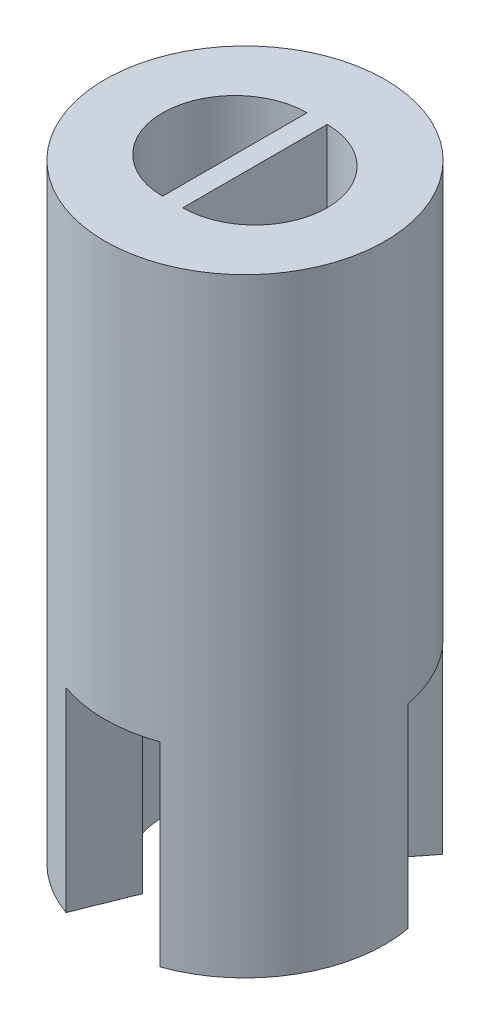
ISO-10303-21;
HEADER;
FILE_DESCRIPTION(('STEP AP214'),'2;1');
FILE_NAME('part.step','',(''),(''),'','','');
FILE_SCHEMA(('AUTOMOTIVE_DESIGN { 1 0 10303 214 1 1 1 1 }'));
ENDSEC;
DATA;
#1=APPLICATION_CONTEXT('core data for automotive mechanical design processes');
#2=APPLICATION_PROTOCOL_DEFINITION('international standard','automotive_design',2000,#1);
#3=PRODUCT_CONTEXT('',#1,'mechanical');
#4=PRODUCT('Part','Part','',(#3));
#5=PRODUCT_RELATED_PRODUCT_CATEGORY('part','',(#4));
#6=PRODUCT_DEFINITION_FORMATION('','',#4);
#7=PRODUCT_DEFINITION_CONTEXT('part definition',#1,'design');
#8=PRODUCT_DEFINITION('design','',#6,#7);
#9=PRODUCT_DEFINITION_SHAPE('','',#8);
#10=(LENGTH_UNIT() NAMED_UNIT(*) SI_UNIT(.MILLI.,.METRE.));
#11=(NAMED_UNIT(*) PLANE_ANGLE_UNIT() SI_UNIT($,.RADIAN.));
#12=(NAMED_UNIT(*) SI_UNIT($,.STERADIAN.) SOLID_ANGLE_UNIT());
#13=UNCERTAINTY_MEASURE_WITH_UNIT(LENGTH_MEASURE(1.E-05),#10,'distance_accuracy_value','');
#14=(GEOMETRIC_REPRESENTATION_CONTEXT(3) GLOBAL_UNCERTAINTY_ASSIGNED_CONTEXT((#13)) GLOBAL_UNIT_ASSIGNED_CONTEXT((#10,
#11,#12)) REPRESENTATION_CONTEXT('',''));
#15=CARTESIAN_POINT('',(0.,0.,0.));
#16=DIRECTION('',(0.,0.,1.));
#17=DIRECTION('',(1.,0.,0.));
#18=AXIS2_PLACEMENT_3D('',#15,#16,#17);
#19=CARTESIAN_POINT('',(0.,25.,0.));
#20=DIRECTION('',(0.,-1.,0.));
#21=DIRECTION('',(0.,0.,-1.));
#22=AXIS2_PLACEMENT_3D('',#19,#20,#21);
#23=CYLINDRICAL_SURFACE('',#22,5.75);
#24=CARTESIAN_POINT('',(0.,25.,0.));
#25=DIRECTION('',(0.,1.,0.));
#26=DIRECTION('',(0.,0.,1.));
#27=AXIS2_PLACEMENT_3D('',#24,#25,#26);
#28=CIRCLE('',#27,5.75);
#29=CARTESIAN_POINT('',(0.,25.,5.75));
#30=VERTEX_POINT('',#29);
#31=EDGE_CURVE('E11',#30,#30,#28,.T.);
#32=ORIENTED_EDGE('',*,*,#31,.F.);
#33=EDGE_LOOP('',(#32));
#34=FACE_BOUND('',#33,.T.);
#35=DIRECTION('',(0.,-1.,0.));
#36=VECTOR('',#35,1.);
#37=CARTESIAN_POINT('',(5.65640898932112,8.,-1.03321698859788));
#38=LINE('',#37,#36);
#39=CARTESIAN_POINT('',(5.65640898932112,8.,-1.03321698859788));
#40=VERTEX_POINT('',#39);
#41=CARTESIAN_POINT('',(5.65640898932112,0.,-1.03321698859788));
#42=VERTEX_POINT('',#41);
#43=EDGE_CURVE('E231',#40,#42,#38,.T.);
#44=ORIENTED_EDGE('',*,*,#43,.F.);
#45=CARTESIAN_POINT('',(-6.48755282626165E-13,8.,2.36346093978593E-13));
#46=DIRECTION('',(0.,1.,0.));
#47=DIRECTION('',(0.866025403784436,0.,-0.500000000000004));
#48=AXIS2_PLACEMENT_3D('',#45,#46,#47);
#49=CIRCLE('',#48,5.75000000000065);
#50=CARTESIAN_POINT('',(3.72299665440796,8.,-4.38198538464789));
#51=VERTEX_POINT('',#50);
#52=EDGE_CURVE('E209',#40,#51,#49,.T.);
#53=ORIENTED_EDGE('',*,*,#52,.T.);
#54=DIRECTION('',(0.,-1.,0.));
#55=VECTOR('',#54,1.);
#56=CARTESIAN_POINT('',(3.72299665440796,8.,-4.38198538464789));
#57=LINE('',#56,#55);
#58=CARTESIAN_POINT('',(3.72299665440796,0.,-4.38198538464789));
#59=VERTEX_POINT('',#58);
#60=EDGE_CURVE('E227',#51,#59,#57,.T.);
#61=ORIENTED_EDGE('',*,*,#60,.T.);
#62=CARTESIAN_POINT('',(0.,0.,0.));
#63=DIRECTION('',(0.,1.,0.));
#64=DIRECTION('',(0.,0.,1.));
#65=AXIS2_PLACEMENT_3D('',#62,#63,#64);
#66=CIRCLE('',#65,5.75);
#67=CARTESIAN_POINT('',(-3.722996654408,0.,-4.38198538464779));
#68=VERTEX_POINT('',#67);
#69=EDGE_CURVE('E345',#59,#68,#66,.T.);
#70=ORIENTED_EDGE('',*,*,#69,.T.);
#71=DIRECTION('',(0.,-1.,0.));
#72=VECTOR('',#71,1.);
#73=CARTESIAN_POINT('',(-3.722996654408,8.,-4.38198538464779));
#74=LINE('',#73,#72);
#75=CARTESIAN_POINT('',(-3.722996654408,8.,-4.38198538464779));
#76=VERTEX_POINT('',#75);
#77=EDGE_CURVE('E267',#76,#68,#74,.T.);
#78=ORIENTED_EDGE('',*,*,#77,.F.);
#79=CARTESIAN_POINT('',(5.29059362783771E-13,8.,4.43665508604313E-13));
#80=DIRECTION('',(0.,1.,0.));
#81=DIRECTION('',(-0.866025403784443,0.,-0.499999999999992));
#82=AXIS2_PLACEMENT_3D('',#79,#80,#81);
#83=CIRCLE('',#82,5.75000000000065);
#84=CARTESIAN_POINT('',(-5.65640898932118,8.,-1.0332169885978));
#85=VERTEX_POINT('',#84);
#86=EDGE_CURVE('E247',#76,#85,#83,.T.);
#87=ORIENTED_EDGE('',*,*,#86,.T.);
#88=DIRECTION('',(0.,-1.,0.));
#89=VECTOR('',#88,1.);
#90=CARTESIAN_POINT('',(-5.65640898932118,8.,-1.0332169885978));
#91=LINE('',#90,#89);
#92=CARTESIAN_POINT('',(-5.65640898932118,0.,-1.0332169885978));
#93=VERTEX_POINT('',#92);
#94=EDGE_CURVE('E263',#85,#93,#91,.T.);
#95=ORIENTED_EDGE('',*,*,#94,.T.);
#96=CARTESIAN_POINT('',(-1.93341233491316,0.,5.41520237324568));
#97=VERTEX_POINT('',#96);
#98=EDGE_CURVE('E314',#93,#97,#66,.T.);
#99=ORIENTED_EDGE('',*,*,#98,.T.);
#100=DIRECTION('',(0.,-1.,0.));
#101=VECTOR('',#100,1.);
#102=CARTESIAN_POINT('',(-1.93341233491316,8.,5.41520237324568));
#103=LINE('',#102,#101);
#104=CARTESIAN_POINT('',(-1.93341233491316,8.,5.41520237324568));
#105=VERTEX_POINT('',#104);
#106=EDGE_CURVE('E301',#105,#97,#103,.T.);
#107=ORIENTED_EDGE('',*,*,#106,.F.);
#108=CARTESIAN_POINT('',(1.196959198424E-13,8.,-6.80011602582908E-13));
#109=DIRECTION('',(0.,1.,0.));
#110=DIRECTION('',(0.,0.,1.));
#111=AXIS2_PLACEMENT_3D('',#108,#109,#110);
#112=CIRCLE('',#111,5.75000000000065);
#113=CARTESIAN_POINT('',(1.93341233491319,8.,5.41520237324572));
#114=VERTEX_POINT('',#113);
#115=EDGE_CURVE('E281',#105,#114,#112,.T.);
#116=ORIENTED_EDGE('',*,*,#115,.T.);
#117=DIRECTION('',(0.,-1.,0.));
#118=VECTOR('',#117,1.);
#119=CARTESIAN_POINT('',(1.93341233491319,8.,5.41520237324572));
#120=LINE('',#119,#118);
#121=CARTESIAN_POINT('',(1.93341233491319,0.,5.41520237324572));
#122=VERTEX_POINT('',#121);
#123=EDGE_CURVE('E297',#114,#122,#120,.T.);
#124=ORIENTED_EDGE('',*,*,#123,.T.);
#125=EDGE_CURVE('E42',#122,#42,#66,.T.);
#126=ORIENTED_EDGE('',*,*,#125,.T.);
#127=EDGE_LOOP('',(#44,#53,#61,#70,#78,#87,#95,#99,#107,#116,#124,#126));
#128=FACE_BOUND('',#127,.T.);
#129=ADVANCED_FACE('F39',(#34,#128),#23,.T.);
#130=CARTESIAN_POINT('',(0.,0.,0.));
#131=DIRECTION('',(0.,1.,0.));
#132=DIRECTION('',(0.,0.,1.));
#133=AXIS2_PLACEMENT_3D('',#130,#131,#132);
#134=PLANE('',#133);
#135=DIRECTION('',(0.989915319978048,0.,-0.141660365920607));
#136=VECTOR('',#135,1.);
#137=CARTESIAN_POINT('',(3.26919523018645,0.,-0.691598298771739));
#138=LINE('',#137,#136);
#139=CARTESIAN_POINT('',(3.26919523018645,0.,-0.691598298771739));
#140=VERTEX_POINT('',#139);
#141=EDGE_CURVE('E217',#140,#42,#138,.T.);
#142=ORIENTED_EDGE('',*,*,#141,.T.);
#143=ORIENTED_EDGE('',*,*,#125,.F.);
#144=DIRECTION('',(-0.372276184392376,0.,-0.928121997656695));
#145=VECTOR('',#144,1.);
#146=CARTESIAN_POINT('',(1.03565591914285,0.,3.17700526865825));
#147=LINE('',#146,#145);
#148=CARTESIAN_POINT('',(1.03565591914285,0.,3.17700526865825));
#149=VERTEX_POINT('',#148);
#150=EDGE_CURVE('E278',#122,#149,#147,.T.);
#151=ORIENTED_EDGE('',*,*,#150,.T.);
#152=CARTESIAN_POINT('',(0.,0.,0.));
#153=DIRECTION('',(0.,1.,0.));
#154=DIRECTION('',(0.,0.,1.));
#155=AXIS2_PLACEMENT_3D('',#152,#153,#154);
#156=CIRCLE('',#155,3.34154839257758);
#157=EDGE_CURVE('E315',#149,#140,#156,.T.);
#158=ORIENTED_EDGE('',*,*,#157,.T.);
#159=EDGE_LOOP('',(#142,#143,#151,#158));
#160=FACE_BOUND('',#159,.T.);
#161=ADVANCED_FACE('F351',(#160),#134,.F.);
#162=DIRECTION('',(-0.617639135585668,0.,0.786461631736088));
#163=VECTOR('',#162,1.);
#164=CARTESIAN_POINT('',(2.23353931104362,0.,-2.48540696988656));
#165=LINE('',#164,#163);
#166=CARTESIAN_POINT('',(2.23353931104362,0.,-2.48540696988656));
#167=VERTEX_POINT('',#166);
#168=EDGE_CURVE('E206',#59,#167,#165,.T.);
#169=ORIENTED_EDGE('',*,*,#168,.T.);
#170=CARTESIAN_POINT('',(-2.23353931104366,0.,-2.4854069698865));
#171=VERTEX_POINT('',#170);
#172=EDGE_CURVE('E318',#167,#171,#156,.T.);
#173=ORIENTED_EDGE('',*,*,#172,.T.);
#174=DIRECTION('',(-0.617639135585672,0.,-0.786461631736084));
#175=VECTOR('',#174,1.);
#176=CARTESIAN_POINT('',(-2.23353931104366,0.,-2.4854069698865));
#177=LINE('',#176,#175);
#178=EDGE_CURVE('E179',#171,#68,#177,.T.);
#179=ORIENTED_EDGE('',*,*,#178,.T.);
#180=ORIENTED_EDGE('',*,*,#69,.F.);
#181=EDGE_LOOP('',(#169,#173,#179,#180));
#182=FACE_BOUND('',#181,.T.);
#183=ADVANCED_FACE('F366',(#182),#134,.F.);
#184=DIRECTION('',(0.989915319978048,0.,0.141660365920601));
#185=VECTOR('',#184,1.);
#186=CARTESIAN_POINT('',(-3.26919523018648,0.,-0.69159829877167));
#187=LINE('',#186,#185);
#188=CARTESIAN_POINT('',(-3.26919523018648,0.,-0.69159829877167));
#189=VERTEX_POINT('',#188);
#190=EDGE_CURVE('E244',#93,#189,#187,.T.);
#191=ORIENTED_EDGE('',*,*,#190,.T.);
#192=CARTESIAN_POINT('',(-1.03565591914281,0.,3.17700526865825));
#193=VERTEX_POINT('',#192);
#194=EDGE_CURVE('E309',#189,#193,#156,.T.);
#195=ORIENTED_EDGE('',*,*,#194,.T.);
#196=DIRECTION('',(-0.372276184392383,0.,0.928121997656692));
#197=VECTOR('',#196,1.);
#198=CARTESIAN_POINT('',(-1.03565591914281,0.,3.17700526865825));
#199=LINE('',#198,#197);
#200=EDGE_CURVE('E238',#193,#97,#199,.T.);
#201=ORIENTED_EDGE('',*,*,#200,.T.);
#202=ORIENTED_EDGE('',*,*,#98,.F.);
#203=EDGE_LOOP('',(#191,#195,#201,#202));
#204=FACE_BOUND('',#203,.T.);
#205=ADVANCED_FACE('F327',(#204),#134,.F.);
#206=CARTESIAN_POINT('',(0.,15.,0.));
#207=DIRECTION('',(0.,-1.,0.));
#208=DIRECTION('',(0.,0.,-1.));
#209=AXIS2_PLACEMENT_3D('',#206,#207,#208);
#210=CYLINDRICAL_SURFACE('',#209,3.34154839257758);
#211=CARTESIAN_POINT('',(0.,15.,0.));
#212=DIRECTION('',(0.,1.,0.));
#213=DIRECTION('',(0.,0.,1.));
#214=AXIS2_PLACEMENT_3D('',#211,#212,#213);
#215=CIRCLE('',#214,3.34154839257758);
#216=CARTESIAN_POINT('',(0.,15.,3.34154839257758));
#217=VERTEX_POINT('',#216);
#218=EDGE_CURVE('E310',#217,#217,#215,.T.);
#219=ORIENTED_EDGE('',*,*,#218,.T.);
#220=EDGE_LOOP('',(#219));
#221=FACE_BOUND('',#220,.T.);
#222=CARTESIAN_POINT('',(-1.69317030779172E-13,8.,0.));
#223=DIRECTION('',(0.,-1.,0.));
#224=DIRECTION('',(0.866025403784436,0.,-0.500000000000004));
#225=AXIS2_PLACEMENT_3D('',#222,#223,#224);
#226=CIRCLE('',#225,3.34154839257776);
#227=CARTESIAN_POINT('',(2.23353931104362,8.,-2.48540696988656));
#228=VERTEX_POINT('',#227);
#229=CARTESIAN_POINT('',(3.26919523018645,8.,-0.691598298771739));
#230=VERTEX_POINT('',#229);
#231=EDGE_CURVE('E201',#228,#230,#226,.T.);
#232=ORIENTED_EDGE('',*,*,#231,.T.);
#233=DIRECTION('',(0.,-1.,0.));
#234=VECTOR('',#233,1.);
#235=CARTESIAN_POINT('',(3.26919523018645,8.,-0.691598298771739));
#236=LINE('',#235,#234);
#237=EDGE_CURVE('E234',#230,#140,#236,.T.);
#238=ORIENTED_EDGE('',*,*,#237,.T.);
#239=ORIENTED_EDGE('',*,*,#157,.F.);
#240=DIRECTION('',(0.,-1.,0.));
#241=VECTOR('',#240,1.);
#242=CARTESIAN_POINT('',(1.03565591914285,8.,3.17700526865825));
#243=LINE('',#242,#241);
#244=CARTESIAN_POINT('',(1.03565591914285,8.,3.17700526865825));
#245=VERTEX_POINT('',#244);
#246=EDGE_CURVE('E288',#245,#149,#243,.T.);
#247=ORIENTED_EDGE('',*,*,#246,.F.);
#248=CARTESIAN_POINT('',(0.,8.,-1.79110198894605E-13));
#249=DIRECTION('',(0.,-1.,0.));
#250=DIRECTION('',(0.,0.,1.));
#251=AXIS2_PLACEMENT_3D('',#248,#249,#250);
#252=CIRCLE('',#251,3.34154839257776);
#253=CARTESIAN_POINT('',(-1.03565591914281,8.,3.17700526865825));
#254=VERTEX_POINT('',#253);
#255=EDGE_CURVE('E273',#245,#254,#252,.T.);
#256=ORIENTED_EDGE('',*,*,#255,.T.);
#257=DIRECTION('',(0.,-1.,0.));
#258=VECTOR('',#257,1.);
#259=CARTESIAN_POINT('',(-1.03565591914281,8.,3.17700526865825));
#260=LINE('',#259,#258);
#261=EDGE_CURVE('E305',#254,#193,#260,.T.);
#262=ORIENTED_EDGE('',*,*,#261,.T.);
#263=ORIENTED_EDGE('',*,*,#194,.F.);
#264=DIRECTION('',(0.,-1.,0.));
#265=VECTOR('',#264,1.);
#266=CARTESIAN_POINT('',(-3.26919523018648,8.,-0.69159829877167));
#267=LINE('',#266,#265);
#268=CARTESIAN_POINT('',(-3.26919523018648,8.,-0.69159829877167));
#269=VERTEX_POINT('',#268);
#270=EDGE_CURVE('E254',#269,#189,#267,.T.);
#271=ORIENTED_EDGE('',*,*,#270,.F.);
#272=CARTESIAN_POINT('',(1.40910933860053E-13,8.,1.14155501001622E-13));
#273=DIRECTION('',(0.,-1.,0.));
#274=DIRECTION('',(-0.866025403784443,0.,-0.499999999999992));
#275=AXIS2_PLACEMENT_3D('',#272,#273,#274);
#276=CIRCLE('',#275,3.34154839257776);
#277=CARTESIAN_POINT('',(-2.23353931104366,8.,-2.4854069698865));
#278=VERTEX_POINT('',#277);
#279=EDGE_CURVE('E239',#269,#278,#276,.T.);
#280=ORIENTED_EDGE('',*,*,#279,.T.);
#281=DIRECTION('',(0.,-1.,0.));
#282=VECTOR('',#281,1.);
#283=CARTESIAN_POINT('',(-2.23353931104366,8.,-2.4854069698865));
#284=LINE('',#283,#282);
#285=EDGE_CURVE('E221',#278,#171,#284,.T.);
#286=ORIENTED_EDGE('',*,*,#285,.T.);
#287=ORIENTED_EDGE('',*,*,#172,.F.);
#288=DIRECTION('',(0.,-1.,0.));
#289=VECTOR('',#288,1.);
#290=CARTESIAN_POINT('',(2.23353931104362,8.,-2.48540696988656));
#291=LINE('',#290,#289);
#292=EDGE_CURVE('E216',#228,#167,#291,.T.);
#293=ORIENTED_EDGE('',*,*,#292,.F.);
#294=EDGE_LOOP('',(#232,#238,#239,#247,#256,#262,#263,#271,#280,#286,#287,#293));
#295=FACE_BOUND('',#294,.T.);
#296=ADVANCED_FACE('F335',(#221,#295),#210,.F.);
#297=CARTESIAN_POINT('',(0.,25.,0.));
#298=DIRECTION('',(0.,1.,0.));
#299=DIRECTION('',(0.,0.,1.));
#300=AXIS2_PLACEMENT_3D('',#297,#298,#299);
#301=PLANE('',#300);
#302=CARTESIAN_POINT('',(0.41,25.,0.));
#303=DIRECTION('',(0.,1.,0.));
#304=DIRECTION('',(0.,0.,-1.));
#305=AXIS2_PLACEMENT_3D('',#302,#303,#304);
#306=CIRCLE('',#305,2.96467159946198);
#307=CARTESIAN_POINT('',(0.41,25.,2.96467159946198));
#308=VERTEX_POINT('',#307);
#309=CARTESIAN_POINT('',(0.41,25.,-2.96467159946198));
#310=VERTEX_POINT('',#309);
#311=EDGE_CURVE('E54',#308,#310,#306,.T.);
#312=ORIENTED_EDGE('',*,*,#311,.F.);
#313=DIRECTION('',(0.,0.,1.));
#314=VECTOR('',#313,1.);
#315=CARTESIAN_POINT('',(0.41,25.,-2.96467159946198));
#316=LINE('',#315,#314);
#317=EDGE_CURVE('E166',#310,#308,#316,.T.);
#318=ORIENTED_EDGE('',*,*,#317,.F.);
#319=EDGE_LOOP('',(#312,#318));
#320=FACE_BOUND('',#319,.T.);
#321=CARTESIAN_POINT('',(-0.416408681207295,25.,0.));
#322=DIRECTION('',(0.,1.,0.));
#323=DIRECTION('',(0.,0.,1.));
#324=AXIS2_PLACEMENT_3D('',#321,#322,#323);
#325=CIRCLE('',#324,2.96556468188459);
#326=CARTESIAN_POINT('',(-0.416408681207295,25.,-2.96556468188459));
#327=VERTEX_POINT('',#326);
#328=CARTESIAN_POINT('',(-0.416408681207294,25.,2.96556468188459));
#329=VERTEX_POINT('',#328);
#330=EDGE_CURVE('E62',#327,#329,#325,.T.);
#331=ORIENTED_EDGE('',*,*,#330,.F.);
#332=DIRECTION('',(0.,0.,-1.));
#333=VECTOR('',#332,1.);
#334=CARTESIAN_POINT('',(-0.416408681207295,25.,-2.96556468188459));
#335=LINE('',#334,#333);
#336=EDGE_CURVE('E186',#329,#327,#335,.T.);
#337=ORIENTED_EDGE('',*,*,#336,.F.);
#338=EDGE_LOOP('',(#331,#337));
#339=FACE_BOUND('',#338,.T.);
#340=ORIENTED_EDGE('',*,*,#31,.T.);
#341=EDGE_LOOP('',(#340));
#342=FACE_BOUND('',#341,.T.);
#343=ADVANCED_FACE('F392',(#320,#339,#342),#301,.T.);
#344=CARTESIAN_POINT('',(0.,15.,0.));
#345=DIRECTION('',(0.,1.,0.));
#346=DIRECTION('',(0.,0.,1.));
#347=AXIS2_PLACEMENT_3D('',#344,#345,#346);
#348=PLANE('',#347);
#349=CARTESIAN_POINT('',(0.,15.,0.));
#350=DIRECTION('',(0.,-1.,0.));
#351=DIRECTION('',(0.,0.,-1.));
#352=AXIS2_PLACEMENT_3D('',#349,#350,#351);
#353=CIRCLE('',#352,0.9);
#354=CARTESIAN_POINT('',(0.,15.,-0.9));
#355=VERTEX_POINT('',#354);
#356=EDGE_CURVE('E553',#355,#355,#353,.T.);
#357=ORIENTED_EDGE('',*,*,#356,.F.);
#358=EDGE_LOOP('',(#357));
#359=FACE_BOUND('',#358,.T.);
#360=ORIENTED_EDGE('',*,*,#218,.F.);
#361=EDGE_LOOP('',(#360));
#362=FACE_BOUND('',#361,.T.);
#363=ADVANCED_FACE('F394',(#359,#362),#348,.F.);
#364=CARTESIAN_POINT('',(-1.03565591914281,8.,3.17700526865825));
#365=DIRECTION('',(0.928121997656692,0.,0.372276184392383));
#366=DIRECTION('',(0.372276184392383,0.,-0.928121997656692));
#367=AXIS2_PLACEMENT_3D('',#364,#365,#366);
#368=PLANE('',#367);
#369=ORIENTED_EDGE('',*,*,#200,.F.);
#370=ORIENTED_EDGE('',*,*,#261,.F.);
#371=DIRECTION('',(-0.372276184392383,0.,0.928121997656692));
#372=VECTOR('',#371,1.);
#373=CARTESIAN_POINT('',(-1.03565591914281,8.,3.17700526865825));
#374=LINE('',#373,#372);
#375=EDGE_CURVE('E277',#254,#105,#374,.T.);
#376=ORIENTED_EDGE('',*,*,#375,.T.);
#377=ORIENTED_EDGE('',*,*,#106,.T.);
#378=EDGE_LOOP('',(#369,#370,#376,#377));
#379=FACE_BOUND('',#378,.T.);
#380=ADVANCED_FACE('F332',(#379),#368,.T.);
#381=CARTESIAN_POINT('',(1.03565591914285,8.,3.17700526865825));
#382=DIRECTION('',(-0.928121997656695,0.,0.372276184392376));
#383=DIRECTION('',(0.372276184392376,0.,0.928121997656695));
#384=AXIS2_PLACEMENT_3D('',#381,#382,#383);
#385=PLANE('',#384);
#386=ORIENTED_EDGE('',*,*,#150,.F.);
#387=ORIENTED_EDGE('',*,*,#123,.F.);
#388=DIRECTION('',(-0.372276184392376,0.,-0.928121997656695));
#389=VECTOR('',#388,1.);
#390=CARTESIAN_POINT('',(1.03565591914285,8.,3.17700526865825));
#391=LINE('',#390,#389);
#392=EDGE_CURVE('E285',#114,#245,#391,.T.);
#393=ORIENTED_EDGE('',*,*,#392,.T.);
#394=ORIENTED_EDGE('',*,*,#246,.T.);
#395=EDGE_LOOP('',(#386,#387,#393,#394));
#396=FACE_BOUND('',#395,.T.);
#397=ADVANCED_FACE('F409',(#396),#385,.T.);
#398=CARTESIAN_POINT('',(0.,8.,-1.79110198894605E-13));
#399=DIRECTION('',(0.,1.,0.));
#400=DIRECTION('',(0.,0.,1.));
#401=AXIS2_PLACEMENT_3D('',#398,#399,#400);
#402=PLANE('',#401);
#403=ORIENTED_EDGE('',*,*,#255,.F.);
#404=ORIENTED_EDGE('',*,*,#392,.F.);
#405=ORIENTED_EDGE('',*,*,#115,.F.);
#406=ORIENTED_EDGE('',*,*,#375,.F.);
#407=EDGE_LOOP('',(#403,#404,#405,#406));
#408=FACE_BOUND('',#407,.T.);
#409=ADVANCED_FACE('F340',(#408),#402,.F.);
#410=CARTESIAN_POINT('',(-2.23353931104366,8.,-2.4854069698865));
#411=DIRECTION('',(-0.786461631736084,0.,0.617639135585672));
#412=DIRECTION('',(0.617639135585672,0.,0.786461631736084));
#413=AXIS2_PLACEMENT_3D('',#410,#411,#412);
#414=PLANE('',#413);
#415=ORIENTED_EDGE('',*,*,#178,.F.);
#416=ORIENTED_EDGE('',*,*,#285,.F.);
#417=DIRECTION('',(-0.617639135585672,0.,-0.786461631736084));
#418=VECTOR('',#417,1.);
#419=CARTESIAN_POINT('',(-2.23353931104366,8.,-2.4854069698865));
#420=LINE('',#419,#418);
#421=EDGE_CURVE('E243',#278,#76,#420,.T.);
#422=ORIENTED_EDGE('',*,*,#421,.T.);
#423=ORIENTED_EDGE('',*,*,#77,.T.);
#424=EDGE_LOOP('',(#415,#416,#422,#423));
#425=FACE_BOUND('',#424,.T.);
#426=ADVANCED_FACE('F368',(#425),#414,.T.);
#427=CARTESIAN_POINT('',(-3.26919523018648,8.,-0.69159829877167));
#428=DIRECTION('',(0.141660365920601,0.,-0.989915319978048));
#429=DIRECTION('',(-0.989915319978048,0.,-0.141660365920601));
#430=AXIS2_PLACEMENT_3D('',#427,#428,#429);
#431=PLANE('',#430);
#432=ORIENTED_EDGE('',*,*,#190,.F.);
#433=ORIENTED_EDGE('',*,*,#94,.F.);
#434=DIRECTION('',(0.989915319978048,0.,0.141660365920601));
#435=VECTOR('',#434,1.);
#436=CARTESIAN_POINT('',(-3.26919523018648,8.,-0.69159829877167));
#437=LINE('',#436,#435);
#438=EDGE_CURVE('E251',#85,#269,#437,.T.);
#439=ORIENTED_EDGE('',*,*,#438,.T.);
#440=ORIENTED_EDGE('',*,*,#270,.T.);
#441=EDGE_LOOP('',(#432,#433,#439,#440));
#442=FACE_BOUND('',#441,.T.);
#443=ADVANCED_FACE('F376',(#442),#431,.T.);
#444=CARTESIAN_POINT('',(1.40910933860053E-13,8.,1.14155501001622E-13));
#445=DIRECTION('',(0.,1.,0.));
#446=DIRECTION('',(-0.866025403784443,0.,-0.499999999999992));
#447=AXIS2_PLACEMENT_3D('',#444,#445,#446);
#448=PLANE('',#447);
#449=ORIENTED_EDGE('',*,*,#279,.F.);
#450=ORIENTED_EDGE('',*,*,#438,.F.);
#451=ORIENTED_EDGE('',*,*,#86,.F.);
#452=ORIENTED_EDGE('',*,*,#421,.F.);
#453=EDGE_LOOP('',(#449,#450,#451,#452));
#454=FACE_BOUND('',#453,.T.);
#455=ADVANCED_FACE('F373',(#454),#448,.F.);
#456=CARTESIAN_POINT('',(3.26919523018645,8.,-0.691598298771739));
#457=DIRECTION('',(-0.141660365920607,0.,-0.989915319978047));
#458=DIRECTION('',(-0.989915319978047,0.,0.141660365920607));
#459=AXIS2_PLACEMENT_3D('',#456,#457,#458);
#460=PLANE('',#459);
#461=ORIENTED_EDGE('',*,*,#141,.F.);
#462=ORIENTED_EDGE('',*,*,#237,.F.);
#463=DIRECTION('',(0.989915319978048,0.,-0.141660365920607));
#464=VECTOR('',#463,1.);
#465=CARTESIAN_POINT('',(3.26919523018645,8.,-0.691598298771739));
#466=LINE('',#465,#464);
#467=EDGE_CURVE('E205',#230,#40,#466,.T.);
#468=ORIENTED_EDGE('',*,*,#467,.T.);
#469=ORIENTED_EDGE('',*,*,#43,.T.);
#470=EDGE_LOOP('',(#461,#462,#468,#469));
#471=FACE_BOUND('',#470,.T.);
#472=ADVANCED_FACE('F353',(#471),#460,.T.);
#473=CARTESIAN_POINT('',(2.23353931104362,8.,-2.48540696988656));
#474=DIRECTION('',(0.786461631736088,0.,0.617639135585668));
#475=DIRECTION('',(0.617639135585668,0.,-0.786461631736088));
#476=AXIS2_PLACEMENT_3D('',#473,#474,#475);
#477=PLANE('',#476);
#478=ORIENTED_EDGE('',*,*,#168,.F.);
#479=ORIENTED_EDGE('',*,*,#60,.F.);
#480=DIRECTION('',(-0.617639135585668,0.,0.786461631736088));
#481=VECTOR('',#480,1.);
#482=CARTESIAN_POINT('',(2.23353931104362,8.,-2.48540696988656));
#483=LINE('',#482,#481);
#484=EDGE_CURVE('E213',#51,#228,#483,.T.);
#485=ORIENTED_EDGE('',*,*,#484,.T.);
#486=ORIENTED_EDGE('',*,*,#292,.T.);
#487=EDGE_LOOP('',(#478,#479,#485,#486));
#488=FACE_BOUND('',#487,.T.);
#489=ADVANCED_FACE('F446',(#488),#477,.T.);
#490=CARTESIAN_POINT('',(-1.69317030779172E-13,8.,0.));
#491=DIRECTION('',(0.,1.,0.));
#492=DIRECTION('',(0.866025403784436,0.,-0.500000000000004));
#493=AXIS2_PLACEMENT_3D('',#490,#491,#492);
#494=PLANE('',#493);
#495=ORIENTED_EDGE('',*,*,#231,.F.);
#496=ORIENTED_EDGE('',*,*,#484,.F.);
#497=ORIENTED_EDGE('',*,*,#52,.F.);
#498=ORIENTED_EDGE('',*,*,#467,.F.);
#499=EDGE_LOOP('',(#495,#496,#497,#498));
#500=FACE_BOUND('',#499,.T.);
#501=ADVANCED_FACE('F360',(#500),#494,.F.);
#502=CARTESIAN_POINT('',(-0.416408681207295,17.,0.));
#503=DIRECTION('',(0.,1.,0.));
#504=DIRECTION('',(0.,0.,1.));
#505=AXIS2_PLACEMENT_3D('',#502,#503,#504);
#506=CYLINDRICAL_SURFACE('',#505,2.96556468188459);
#507=ORIENTED_EDGE('',*,*,#330,.T.);
#508=DIRECTION('',(0.,1.,0.));
#509=VECTOR('',#508,1.);
#510=CARTESIAN_POINT('',(-0.416408681207294,17.,2.96556468188459));
#511=LINE('',#510,#509);
#512=CARTESIAN_POINT('',(-0.416408681207294,17.,2.96556468188459));
#513=VERTEX_POINT('',#512);
#514=EDGE_CURVE('E190',#513,#329,#511,.T.);
#515=ORIENTED_EDGE('',*,*,#514,.F.);
#516=CARTESIAN_POINT('',(-0.416408681207295,17.,0.));
#517=DIRECTION('',(0.,1.,0.));
#518=DIRECTION('',(0.,0.,1.));
#519=AXIS2_PLACEMENT_3D('',#516,#517,#518);
#520=CIRCLE('',#519,2.96556468188459);
#521=CARTESIAN_POINT('',(-0.416408681207295,17.,-2.96556468188459));
#522=VERTEX_POINT('',#521);
#523=EDGE_CURVE('E181',#522,#513,#520,.T.);
#524=ORIENTED_EDGE('',*,*,#523,.F.);
#525=DIRECTION('',(0.,1.,0.));
#526=VECTOR('',#525,1.);
#527=CARTESIAN_POINT('',(-0.416408681207295,17.,-2.96556468188459));
#528=LINE('',#527,#526);
#529=EDGE_CURVE('E175',#522,#327,#528,.T.);
#530=ORIENTED_EDGE('',*,*,#529,.T.);
#531=EDGE_LOOP('',(#507,#515,#524,#530));
#532=FACE_BOUND('',#531,.T.);
#533=ADVANCED_FACE('F462',(#532),#506,.F.);
#534=CARTESIAN_POINT('',(-0.416408681207295,17.,-2.96556468188459));
#535=DIRECTION('',(1.,0.,0.));
#536=DIRECTION('',(0.,0.,-1.));
#537=AXIS2_PLACEMENT_3D('',#534,#535,#536);
#538=PLANE('',#537);
#539=ORIENTED_EDGE('',*,*,#336,.T.);
#540=ORIENTED_EDGE('',*,*,#529,.F.);
#541=DIRECTION('',(0.,0.,-1.));
#542=VECTOR('',#541,1.);
#543=CARTESIAN_POINT('',(-0.416408681207295,17.,-2.96556468188459));
#544=LINE('',#543,#542);
#545=EDGE_CURVE('E185',#513,#522,#544,.T.);
#546=ORIENTED_EDGE('',*,*,#545,.F.);
#547=ORIENTED_EDGE('',*,*,#514,.T.);
#548=EDGE_LOOP('',(#539,#540,#546,#547));
#549=FACE_BOUND('',#548,.T.);
#550=ADVANCED_FACE('F477',(#549),#538,.F.);
#551=CARTESIAN_POINT('',(-0.416408681207295,17.,0.));
#552=DIRECTION('',(0.,1.,0.));
#553=DIRECTION('',(0.,0.,1.));
#554=AXIS2_PLACEMENT_3D('',#551,#552,#553);
#555=PLANE('',#554);
#556=ORIENTED_EDGE('',*,*,#523,.T.);
#557=ORIENTED_EDGE('',*,*,#545,.T.);
#558=EDGE_LOOP('',(#556,#557));
#559=FACE_BOUND('',#558,.T.);
#560=ADVANCED_FACE('F486',(#559),#555,.T.);
#561=CARTESIAN_POINT('',(0.41,17.,0.));
#562=DIRECTION('',(0.,1.,0.));
#563=DIRECTION('',(0.,0.,1.));
#564=AXIS2_PLACEMENT_3D('',#561,#562,#563);
#565=CYLINDRICAL_SURFACE('',#564,2.96467159946198);
#566=ORIENTED_EDGE('',*,*,#311,.T.);
#567=DIRECTION('',(0.,1.,0.));
#568=VECTOR('',#567,1.);
#569=CARTESIAN_POINT('',(0.41,17.,-2.96467159946198));
#570=LINE('',#569,#568);
#571=CARTESIAN_POINT('',(0.41,17.,-2.96467159946198));
#572=VERTEX_POINT('',#571);
#573=EDGE_CURVE('E150',#572,#310,#570,.T.);
#574=ORIENTED_EDGE('',*,*,#573,.F.);
#575=CARTESIAN_POINT('',(0.41,17.,0.));
#576=DIRECTION('',(0.,1.,0.));
#577=DIRECTION('',(0.,0.,-1.));
#578=AXIS2_PLACEMENT_3D('',#575,#576,#577);
#579=CIRCLE('',#578,2.96467159946198);
#580=CARTESIAN_POINT('',(0.41,17.,2.96467159946198));
#581=VERTEX_POINT('',#580);
#582=EDGE_CURVE('E153',#581,#572,#579,.T.);
#583=ORIENTED_EDGE('',*,*,#582,.F.);
#584=DIRECTION('',(0.,1.,0.));
#585=VECTOR('',#584,1.);
#586=CARTESIAN_POINT('',(0.41,17.,2.96467159946198));
#587=LINE('',#586,#585);
#588=EDGE_CURVE('E160',#581,#308,#587,.T.);
#589=ORIENTED_EDGE('',*,*,#588,.T.);
#590=EDGE_LOOP('',(#566,#574,#583,#589));
#591=FACE_BOUND('',#590,.T.);
#592=ADVANCED_FACE('F152',(#591),#565,.F.);
#593=CARTESIAN_POINT('',(0.41,17.,-2.96467159946198));
#594=DIRECTION('',(-1.,0.,0.));
#595=DIRECTION('',(0.,0.,1.));
#596=AXIS2_PLACEMENT_3D('',#593,#594,#595);
#597=PLANE('',#596);
#598=ORIENTED_EDGE('',*,*,#317,.T.);
#599=ORIENTED_EDGE('',*,*,#588,.F.);
#600=DIRECTION('',(0.,0.,1.));
#601=VECTOR('',#600,1.);
#602=CARTESIAN_POINT('',(0.41,17.,-2.96467159946198));
#603=LINE('',#602,#601);
#604=EDGE_CURVE('E161',#572,#581,#603,.T.);
#605=ORIENTED_EDGE('',*,*,#604,.F.);
#606=ORIENTED_EDGE('',*,*,#573,.T.);
#607=EDGE_LOOP('',(#598,#599,#605,#606));
#608=FACE_BOUND('',#607,.T.);
#609=ADVANCED_FACE('F168',(#608),#597,.F.);
#610=CARTESIAN_POINT('',(0.41,17.,0.));
#611=DIRECTION('',(0.,-1.,0.));
#612=DIRECTION('',(0.,0.,-1.));
#613=AXIS2_PLACEMENT_3D('',#610,#611,#612);
#614=PLANE('',#613);
#615=ORIENTED_EDGE('',*,*,#582,.T.);
#616=ORIENTED_EDGE('',*,*,#604,.T.);
#617=EDGE_LOOP('',(#615,#616));
#618=FACE_BOUND('',#617,.T.);
#619=ADVANCED_FACE('F164',(#618),#614,.F.);
#620=CARTESIAN_POINT('',(0.,15.1,0.));
#621=DIRECTION('',(0.,-1.,0.));
#622=DIRECTION('',(0.,0.,-1.));
#623=AXIS2_PLACEMENT_3D('',#620,#621,#622);
#624=CYLINDRICAL_SURFACE('',#623,0.9);
#625=CARTESIAN_POINT('',(0.,15.1,0.));
#626=DIRECTION('',(0.,-1.,0.));
#627=DIRECTION('',(0.,0.,-1.));
#628=AXIS2_PLACEMENT_3D('',#625,#626,#627);
#629=CIRCLE('',#628,0.9);
#630=CARTESIAN_POINT('',(0.,15.1,-0.9));
#631=VERTEX_POINT('',#630);
#632=EDGE_CURVE('E193',#631,#631,#629,.T.);
#633=ORIENTED_EDGE('',*,*,#632,.F.);
#634=EDGE_LOOP('',(#633));
#635=FACE_BOUND('',#634,.T.);
#636=ORIENTED_EDGE('',*,*,#356,.T.);
#637=EDGE_LOOP('',(#636));
#638=FACE_BOUND('',#637,.T.);
#639=ADVANCED_FACE('F521',(#635,#638),#624,.F.);
#640=CARTESIAN_POINT('',(0.,15.1,0.));
#641=DIRECTION('',(0.,-1.,0.));
#642=DIRECTION('',(0.,0.,-1.));
#643=AXIS2_PLACEMENT_3D('',#640,#641,#642);
#644=PLANE('',#643);
#645=ORIENTED_EDGE('',*,*,#632,.T.);
#646=EDGE_LOOP('',(#645));
#647=FACE_BOUND('',#646,.T.);
#648=ADVANCED_FACE('F536',(#647),#644,.T.);
#649=CLOSED_SHELL('',(#129,#161,#183,#205,#296,#343,#363,#380,#397,#409,#426,#443,#455,#472,
#489,#501,#533,#550,#560,#592,#609,#619,#639,#648));
#650=MANIFOLD_SOLID_BREP('B2',#649);
#651=ADVANCED_BREP_SHAPE_REPRESENTATION('',(#18,#650),#14);
#652=SHAPE_DEFINITION_REPRESENTATION(#9,#651);
ENDSEC;
END-ISO-10303-21;
